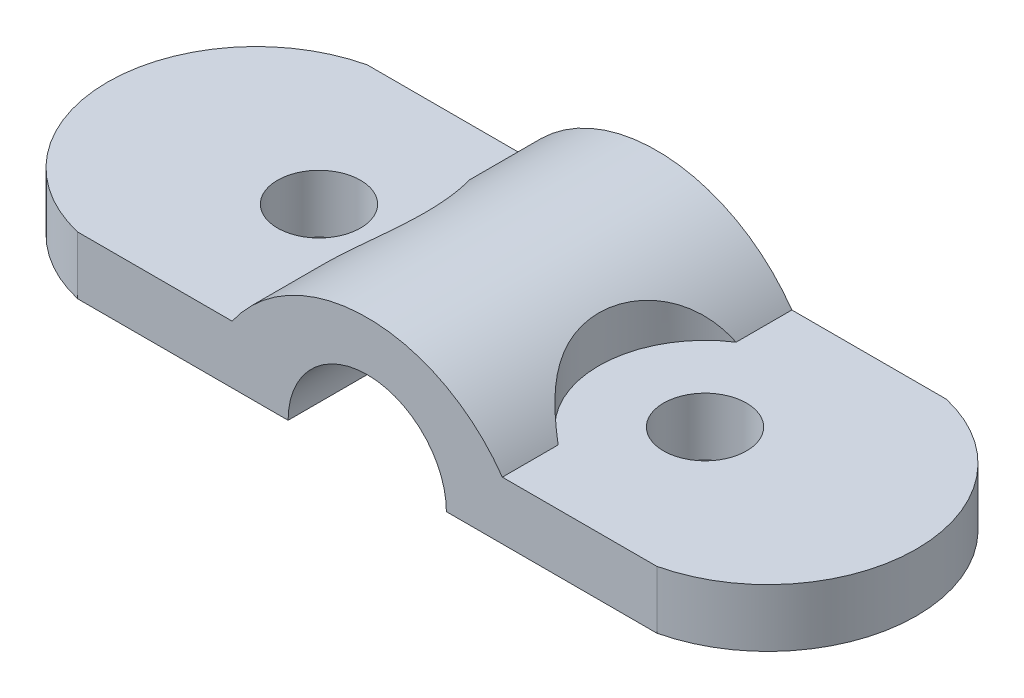
ISO-10303-21;
HEADER;
FILE_DESCRIPTION(('STEP AP214'),'2;1');
FILE_NAME('part.step','',(''),(''),'','','');
FILE_SCHEMA(('AUTOMOTIVE_DESIGN { 1 0 10303 214 1 1 1 1 }'));
ENDSEC;
DATA;
#1=APPLICATION_CONTEXT('core data for automotive mechanical design processes');
#2=APPLICATION_PROTOCOL_DEFINITION('international standard','automotive_design',2000,#1);
#3=PRODUCT_CONTEXT('',#1,'mechanical');
#4=PRODUCT('Part','Part','',(#3));
#5=PRODUCT_RELATED_PRODUCT_CATEGORY('part','',(#4));
#6=PRODUCT_DEFINITION_FORMATION('','',#4);
#7=PRODUCT_DEFINITION_CONTEXT('part definition',#1,'design');
#8=PRODUCT_DEFINITION('design','',#6,#7);
#9=PRODUCT_DEFINITION_SHAPE('','',#8);
#10=(LENGTH_UNIT() NAMED_UNIT(*) SI_UNIT(.MILLI.,.METRE.));
#11=(NAMED_UNIT(*) PLANE_ANGLE_UNIT() SI_UNIT($,.RADIAN.));
#12=(NAMED_UNIT(*) SI_UNIT($,.STERADIAN.) SOLID_ANGLE_UNIT());
#13=UNCERTAINTY_MEASURE_WITH_UNIT(LENGTH_MEASURE(1.E-05),#10,'distance_accuracy_value','');
#14=(GEOMETRIC_REPRESENTATION_CONTEXT(3) GLOBAL_UNCERTAINTY_ASSIGNED_CONTEXT((#13)) GLOBAL_UNIT_ASSIGNED_CONTEXT((#10,
#11,#12)) REPRESENTATION_CONTEXT('',''));
#15=CARTESIAN_POINT('',(0.,0.,0.));
#16=DIRECTION('',(0.,0.,1.));
#17=DIRECTION('',(1.,0.,0.));
#18=AXIS2_PLACEMENT_3D('',#15,#16,#17);
#19=CARTESIAN_POINT('',(0.,-1.87026035220902,15.));
#20=DIRECTION('',(0.,0.,-1.));
#21=DIRECTION('',(-1.,0.,0.));
#22=AXIS2_PLACEMENT_3D('',#19,#20,#21);
#23=CYLINDRICAL_SURFACE('',#22,8.52756916701935);
#24=DIRECTION('',(0.,0.,-1.));
#25=VECTOR('',#24,1.);
#26=CARTESIAN_POINT('',(-7.,3.,15.));
#27=LINE('',#26,#25);
#28=CARTESIAN_POINT('',(-7.,3.,2.89022777135356));
#29=VERTEX_POINT('',#28);
#30=CARTESIAN_POINT('',(-7.,3.,0.));
#31=VERTEX_POINT('',#30);
#32=EDGE_CURVE('E43',#29,#31,#27,.T.);
#33=ORIENTED_EDGE('',*,*,#32,.F.);
#34=CARTESIAN_POINT('',(-7.,3.,2.89022777135356));
#35=CARTESIAN_POINT('',(-6.92268728027968,3.11117549805194,2.94054057696233));
#36=CARTESIAN_POINT('',(-6.84349773405888,3.2192938672115,2.99484738439601));
#37=CARTESIAN_POINT('',(-6.6825133502771,3.42887001988714,3.11203912689447));
#38=CARTESIAN_POINT('',(-6.60071663993231,3.53032284761541,3.17493033984949));
#39=CARTESIAN_POINT('',(-6.43556714526111,3.72611279807268,3.30998560152396));
#40=CARTESIAN_POINT('',(-6.35221084105641,3.82043055104947,3.38217354866874));
#41=CARTESIAN_POINT('',(-6.18561453589318,4.00108482914601,3.53599807418573));
#42=CARTESIAN_POINT('',(-6.1023745097471,4.08742348704196,3.6176321144444));
#43=CARTESIAN_POINT('',(-5.93709189221903,4.25216312617291,3.79093157846298));
#44=CARTESIAN_POINT('',(-5.85505826438949,4.33051842990904,3.88264909680767));
#45=CARTESIAN_POINT('',(-5.69429035476473,4.4784744048078,4.07558328141524));
#46=CARTESIAN_POINT('',(-5.61555639651068,4.54807421880501,4.17680087604767));
#47=CARTESIAN_POINT('',(-5.46319541504041,4.67824748020346,4.38803550112382));
#48=CARTESIAN_POINT('',(-5.38955726232851,4.73884095330314,4.49803214741646));
#49=CARTESIAN_POINT('',(-5.2487189920238,4.85123555072687,4.72631823443613));
#50=CARTESIAN_POINT('',(-5.18151826072318,4.90303751354849,4.84460688278427));
#51=CARTESIAN_POINT('',(-5.06023394678944,4.99404783612336,5.07831401603095));
#52=CARTESIAN_POINT('',(-5.00552264368623,5.03394864687648,5.19313849966154));
#53=CARTESIAN_POINT('',(-4.90353312653237,5.10675384207423,5.42818081414692));
#54=CARTESIAN_POINT('',(-4.85625477565628,5.1396583553103,5.54839854567067));
#55=CARTESIAN_POINT('',(-4.76984144118472,5.19874189411727,5.79344340009702));
#56=CARTESIAN_POINT('',(-4.73071313424696,5.22491540962435,5.91827420431697));
#57=CARTESIAN_POINT('',(-4.66123697340056,5.27075076200323,6.17152348633035));
#58=CARTESIAN_POINT('',(-4.6308891403048,5.29041258344,6.29994197262708));
#59=CARTESIAN_POINT('',(-4.58001685543475,5.32305413194141,6.55635559098766));
#60=CARTESIAN_POINT('',(-4.55927829416608,5.33618004343954,6.68428973964994));
#61=CARTESIAN_POINT('',(-4.52685945298461,5.3565887051769,6.94180679660557));
#62=CARTESIAN_POINT('',(-4.51518227830453,5.36386945237525,7.0713902546499));
#63=CARTESIAN_POINT('',(-4.5010541627791,5.37266838631858,7.33116678665589));
#64=CARTESIAN_POINT('',(-4.49859709071402,5.37419040253249,7.46135939783829));
#65=CARTESIAN_POINT('',(-4.50292441479719,5.37150144773435,7.72159089538529));
#66=CARTESIAN_POINT('',(-4.50971301842008,5.36728786659656,7.85162968479018));
#67=CARTESIAN_POINT('',(-4.53254562297954,5.35301098622444,8.11164880275672));
#68=CARTESIAN_POINT('',(-4.54866511713952,5.34289996758092,8.24161989484403));
#69=CARTESIAN_POINT('',(-4.58999368597933,5.31667164977994,8.4994336393002));
#70=CARTESIAN_POINT('',(-4.61519862110189,5.30055708587793,8.62727723330367));
#71=CARTESIAN_POINT('',(-4.67436767121665,5.26212820321908,8.88003403499788));
#72=CARTESIAN_POINT('',(-4.70833573651212,5.23981108808239,9.00494589332383));
#73=CARTESIAN_POINT('',(-4.78452673282003,5.18876506427709,9.25082758077557));
#74=CARTESIAN_POINT('',(-4.82674646982636,5.16003863587871,9.37179891410524));
#75=CARTESIAN_POINT('',(-4.91863871445134,5.096054938595,9.60851203283065));
#76=CARTESIAN_POINT('',(-4.96828123317668,5.06082382075183,9.72427252802092));
#77=CARTESIAN_POINT('',(-5.07437317971467,4.98353254855512,9.95026155131803));
#78=CARTESIAN_POINT('',(-5.1308225675519,4.94147243430645,10.0604901119075));
#79=CARTESIAN_POINT('',(-5.24959384240145,4.85036433341084,10.2746398356368));
#80=CARTESIAN_POINT('',(-5.31191292251518,4.80131968109661,10.3785639748656));
#81=CARTESIAN_POINT('',(-5.44141785590529,4.69612096678562,10.5795488393447));
#82=CARTESIAN_POINT('',(-5.5086036280703,4.63996702326513,10.6766096789299));
#83=CARTESIAN_POINT('',(-5.6465577564401,4.52067958936611,10.8631785389924));
#84=CARTESIAN_POINT('',(-5.71731720477794,4.45756302977995,10.9527039867503));
#85=CARTESIAN_POINT('',(-5.8614034800827,4.32433499781914,11.1241635900013));
#86=CARTESIAN_POINT('',(-5.93473046119281,4.25422310500697,11.2060972886393));
#87=CARTESIAN_POINT('',(-6.08282590480577,4.10716027967403,11.362297100994));
#88=CARTESIAN_POINT('',(-6.15759530651685,4.03020476466569,11.4365580039735));
#89=CARTESIAN_POINT('',(-6.30736949015319,3.86982418328063,11.5773826299723));
#90=CARTESIAN_POINT('',(-6.38237422766719,3.78640027450677,11.6439477249687));
#91=CARTESIAN_POINT('',(-6.55007953443996,3.59198952583854,11.7851905685084));
#92=CARTESIAN_POINT('',(-6.64256106588083,3.47929409919076,11.8577932433659));
#93=CARTESIAN_POINT('',(-6.77879582132811,3.30398709899006,11.9583654847579));
#94=CARTESIAN_POINT('',(-6.82373001635837,3.24459728289984,11.9904607638796));
#95=CARTESIAN_POINT('',(-6.91263192830168,3.12379412617615,12.0520410091246));
#96=CARTESIAN_POINT('',(-6.95659981544907,3.06238114680491,12.0815264378411));
#97=CARTESIAN_POINT('',(-7.,3.,12.1097722286464));
#98=B_SPLINE_CURVE_WITH_KNOTS('',3,(#34,#35,#36,#37,#38,#39,#40,#41,#42,#43,#44,#45,#46,#47,#48,
#49,#50,#51,#52,#53,#54,#55,#56,#57,#58,#59,#60,#61,#62,#63,#64,#65,#66,#67,#68,#69,#70,#71,#72,
#73,#74,#75,#76,#77,#78,#79,#80,#81,#82,#83,#84,#85,#86,#87,#88,#89,#90,#91,#92,#93,#94,#95,#96,
#97),.UNSPECIFIED.,.F.,.F.,(4,2,2,2,2,2,2,2,2,2,2,2,2,2,2,2,2,2,2,2,2,2,2,2,2,2,2,2,2,2,2,4),
(0.,0.433346011105791,0.867010649032036,1.30181320036781,1.7364991927435,2.17354701047934,
2.61063758210038,3.0467412522891,3.48280330532549,3.88222459923133,4.28163853974723,
4.68137841124259,5.08111923025746,5.47146520580942,5.86194488942608,6.2521648642808,
6.64256247778691,7.03616371831739,7.42958585035347,7.82318564272859,8.21663338358204,
8.60853247794339,9.00042927086972,9.39213960035022,9.78384340284033,10.1746148750163,
10.565409847726,10.9564684958187,11.3474573197206,11.8353012655249,12.0785251382898,
12.321705813184),.UNSPECIFIED.);
#99=CARTESIAN_POINT('',(-7.,3.,12.1097722286464));
#100=VERTEX_POINT('',#99);
#101=EDGE_CURVE('E112',#29,#100,#98,.T.);
#102=ORIENTED_EDGE('',*,*,#101,.T.);
#103=CARTESIAN_POINT('',(-7.,3.,15.));
#104=VERTEX_POINT('',#103);
#105=EDGE_CURVE('E11',#104,#100,#27,.T.);
#106=ORIENTED_EDGE('',*,*,#105,.F.);
#107=CARTESIAN_POINT('',(0.,-1.87026035220902,15.));
#108=DIRECTION('',(0.,0.,1.));
#109=DIRECTION('',(1.,0.,0.));
#110=AXIS2_PLACEMENT_3D('',#107,#108,#109);
#111=CIRCLE('',#110,8.52756916701935);
#112=CARTESIAN_POINT('',(7.,3.,15.));
#113=VERTEX_POINT('',#112);
#114=EDGE_CURVE('E131',#104,#113,#111,.F.);
#115=ORIENTED_EDGE('',*,*,#114,.T.);
#116=DIRECTION('',(0.,0.,-1.));
#117=VECTOR('',#116,1.);
#118=CARTESIAN_POINT('',(7.,3.,15.));
#119=LINE('',#118,#117);
#120=CARTESIAN_POINT('',(7.,3.,12.1097722286464));
#121=VERTEX_POINT('',#120);
#122=EDGE_CURVE('E174',#113,#121,#119,.T.);
#123=ORIENTED_EDGE('',*,*,#122,.T.);
#124=CARTESIAN_POINT('',(7.,3.,12.1097722286464));
#125=CARTESIAN_POINT('',(6.92268728027968,3.11117549805194,12.0594594230377));
#126=CARTESIAN_POINT('',(6.84349773405888,3.2192938672115,12.005152615604));
#127=CARTESIAN_POINT('',(6.6825133502771,3.42887001988714,11.8879608731055));
#128=CARTESIAN_POINT('',(6.60071663993231,3.53032284761541,11.8250696601505));
#129=CARTESIAN_POINT('',(6.43556714526111,3.72611279807268,11.690014398476));
#130=CARTESIAN_POINT('',(6.35221084105642,3.82043055104947,11.6178264513313));
#131=CARTESIAN_POINT('',(6.18561453589318,4.00108482914601,11.4640019258143));
#132=CARTESIAN_POINT('',(6.1023745097471,4.08742348704196,11.3823678855556));
#133=CARTESIAN_POINT('',(5.93709189221903,4.2521631261729,11.209068421537));
#134=CARTESIAN_POINT('',(5.85505826438949,4.33051842990904,11.1173509031923));
#135=CARTESIAN_POINT('',(5.69429035476473,4.4784744048078,10.9244167185848));
#136=CARTESIAN_POINT('',(5.61555639651069,4.54807421880501,10.8231991239523));
#137=CARTESIAN_POINT('',(5.46319541504042,4.67824748020346,10.6119644988762));
#138=CARTESIAN_POINT('',(5.38955726232851,4.73884095330314,10.5019678525835));
#139=CARTESIAN_POINT('',(5.2487189920238,4.85123555072687,10.2736817655639));
#140=CARTESIAN_POINT('',(5.18151826072318,4.90303751354849,10.1553931172157));
#141=CARTESIAN_POINT('',(5.06023394678944,4.99404783612336,9.92168598396905));
#142=CARTESIAN_POINT('',(5.00552264368623,5.03394864687648,9.80686150033845));
#143=CARTESIAN_POINT('',(4.90353312653237,5.10675384207423,9.57181918585308));
#144=CARTESIAN_POINT('',(4.85625477565628,5.13965835531031,9.45160145432932));
#145=CARTESIAN_POINT('',(4.76984144118472,5.19874189411728,9.20655659990298));
#146=CARTESIAN_POINT('',(4.73071313424696,5.22491540962435,9.08172579568303));
#147=CARTESIAN_POINT('',(4.66123697340056,5.27075076200323,8.82847651366965));
#148=CARTESIAN_POINT('',(4.6308891403048,5.29041258344,8.70005802737292));
#149=CARTESIAN_POINT('',(4.58001685543475,5.32305413194141,8.44364440901234));
#150=CARTESIAN_POINT('',(4.55927829416608,5.33618004343953,8.31571026035007));
#151=CARTESIAN_POINT('',(4.52685945298461,5.3565887051769,8.05819320339443));
#152=CARTESIAN_POINT('',(4.51518227830453,5.36386945237525,7.92860974535011));
#153=CARTESIAN_POINT('',(4.5010541627791,5.37266838631858,7.66883321334411));
#154=CARTESIAN_POINT('',(4.49859709071402,5.37419040253249,7.53864060216171));
#155=CARTESIAN_POINT('',(4.5029244147972,5.37150144773435,7.27840910461472));
#156=CARTESIAN_POINT('',(4.50971301842008,5.36728786659656,7.14837031520982));
#157=CARTESIAN_POINT('',(4.53254562297954,5.35301098622444,6.88835119724328));
#158=CARTESIAN_POINT('',(4.54866511713952,5.34289996758092,6.75838010515597));
#159=CARTESIAN_POINT('',(4.58999368597933,5.31667164977994,6.5005663606998));
#160=CARTESIAN_POINT('',(4.61519862110189,5.30055708587793,6.37272276669634));
#161=CARTESIAN_POINT('',(4.67436767121665,5.26212820321908,6.11996596500213));
#162=CARTESIAN_POINT('',(4.70833573651212,5.23981108808239,5.99505410667617));
#163=CARTESIAN_POINT('',(4.78452673282003,5.18876506427709,5.74917241922444));
#164=CARTESIAN_POINT('',(4.82674646982635,5.16003863587871,5.62820108589477));
#165=CARTESIAN_POINT('',(4.91863871445134,5.096054938595,5.39148796716935));
#166=CARTESIAN_POINT('',(4.96828123317667,5.06082382075183,5.27572747197909));
#167=CARTESIAN_POINT('',(5.07437317971466,4.98353254855512,5.04973844868197));
#168=CARTESIAN_POINT('',(5.1308225675519,4.94147243430645,4.93950988809253));
#169=CARTESIAN_POINT('',(5.24959384240145,4.85036433341085,4.72536016436325));
#170=CARTESIAN_POINT('',(5.31191292251518,4.80131968109662,4.62143602513444));
#171=CARTESIAN_POINT('',(5.44141785590529,4.69612096678562,4.4204511606553));
#172=CARTESIAN_POINT('',(5.5086036280703,4.63996702326513,4.32339032107013));
#173=CARTESIAN_POINT('',(5.64655775644009,4.52067958936612,4.13682146100758));
#174=CARTESIAN_POINT('',(5.71731720477794,4.45756302977996,4.04729601324969));
#175=CARTESIAN_POINT('',(5.8614034800827,4.32433499781914,3.8758364099987));
#176=CARTESIAN_POINT('',(5.93473046119281,4.25422310500698,3.79390271136073));
#177=CARTESIAN_POINT('',(6.08282590480576,4.10716027967403,3.63770289900604));
#178=CARTESIAN_POINT('',(6.15759530651685,4.03020476466569,3.56344199602646));
#179=CARTESIAN_POINT('',(6.30736949015318,3.86982418328063,3.42261737002766));
#180=CARTESIAN_POINT('',(6.38237422766719,3.78640027450678,3.35605227503127));
#181=CARTESIAN_POINT('',(6.55007953443996,3.59198952583854,3.21480943149164));
#182=CARTESIAN_POINT('',(6.64256106588083,3.47929409919076,3.14220675663409));
#183=CARTESIAN_POINT('',(6.7787958213281,3.30398709899006,3.04163451524209));
#184=CARTESIAN_POINT('',(6.82373001635837,3.24459728289984,3.00953923612036));
#185=CARTESIAN_POINT('',(6.91263192830168,3.12379412617615,2.94795899087541));
#186=CARTESIAN_POINT('',(6.95659981544907,3.06238114680491,2.91847356215894));
#187=CARTESIAN_POINT('',(7.,3.,2.89022777135356));
#188=B_SPLINE_CURVE_WITH_KNOTS('',3,(#124,#125,#126,#127,#128,#129,#130,#131,#132,#133,#134,
#135,#136,#137,#138,#139,#140,#141,#142,#143,#144,#145,#146,#147,#148,#149,#150,#151,#152,#153,
#154,#155,#156,#157,#158,#159,#160,#161,#162,#163,#164,#165,#166,#167,#168,#169,#170,#171,#172,
#173,#174,#175,#176,#177,#178,#179,#180,#181,#182,#183,#184,#185,#186,#187),.UNSPECIFIED.,.F.,
.F.,(4,2,2,2,2,2,2,2,2,2,2,2,2,2,2,2,2,2,2,2,2,2,2,2,2,2,2,2,2,2,2,4),(0.,0.433346011105791,
0.867010649032035,1.30181320036781,1.7364991927435,2.17354701047934,2.61063758210038,
3.04674125228909,3.48280330532549,3.88222459923133,4.28163853974723,4.68137841124259,
5.08111923025745,5.47146520580942,5.86194488942607,6.25216486428079,6.6425624777869,
7.03616371831739,7.42958585035346,7.82318564272858,8.21663338358203,8.60853247794338,
9.00042927086971,9.39213960035021,9.78384340284033,10.1746148750163,10.565409847726,
10.9564684958186,11.3474573197206,11.8353012655249,12.0785251382898,12.321705813184),.UNSPECIFIED.);
#189=CARTESIAN_POINT('',(7.,3.,2.89022777135356));
#190=VERTEX_POINT('',#189);
#191=EDGE_CURVE('E189',#121,#190,#188,.T.);
#192=ORIENTED_EDGE('',*,*,#191,.T.);
#193=CARTESIAN_POINT('',(7.,3.,0.));
#194=VERTEX_POINT('',#193);
#195=EDGE_CURVE('E150',#190,#194,#119,.T.);
#196=ORIENTED_EDGE('',*,*,#195,.T.);
#197=CARTESIAN_POINT('',(0.,-1.87026035220902,0.));
#198=DIRECTION('',(0.,0.,1.));
#199=DIRECTION('',(1.,0.,0.));
#200=AXIS2_PLACEMENT_3D('',#197,#198,#199);
#201=CIRCLE('',#200,8.52756916701935);
#202=EDGE_CURVE('E151',#31,#194,#201,.F.);
#203=ORIENTED_EDGE('',*,*,#202,.F.);
#204=EDGE_LOOP('',(#33,#102,#106,#115,#123,#192,#196,#203));
#205=FACE_BOUND('',#204,.T.);
#206=ADVANCED_FACE('F35',(#205),#23,.T.);
#207=CARTESIAN_POINT('',(0.,3.,15.));
#208=DIRECTION('',(0.,1.,0.));
#209=DIRECTION('',(0.,0.,1.));
#210=AXIS2_PLACEMENT_3D('',#207,#208,#209);
#211=PLANE('',#210);
#212=CARTESIAN_POINT('',(-10.,3.,7.5));
#213=DIRECTION('',(0.,1.,0.));
#214=DIRECTION('',(-1.,0.,0.));
#215=AXIS2_PLACEMENT_3D('',#212,#213,#214);
#216=CIRCLE('',#215,2.15);
#217=CARTESIAN_POINT('',(-12.15,3.,7.5));
#218=VERTEX_POINT('',#217);
#219=EDGE_CURVE('E310',#218,#218,#216,.T.);
#220=ORIENTED_EDGE('',*,*,#219,.F.);
#221=EDGE_LOOP('',(#220));
#222=FACE_BOUND('',#221,.T.);
#223=ORIENTED_EDGE('',*,*,#105,.T.);
#224=CARTESIAN_POINT('',(-10.,3.,7.5));
#225=DIRECTION('',(0.,1.,0.));
#226=DIRECTION('',(-1.,0.,0.));
#227=AXIS2_PLACEMENT_3D('',#224,#225,#226);
#228=CIRCLE('',#227,5.5);
#229=EDGE_CURVE('E49',#100,#29,#228,.T.);
#230=ORIENTED_EDGE('',*,*,#229,.T.);
#231=ORIENTED_EDGE('',*,*,#32,.T.);
#232=DIRECTION('',(1.,0.,0.));
#233=VECTOR('',#232,1.);
#234=CARTESIAN_POINT('',(0.,3.,0.));
#235=LINE('',#234,#233);
#236=CARTESIAN_POINT('',(-15.,3.,0.));
#237=VERTEX_POINT('',#236);
#238=EDGE_CURVE('E154',#237,#31,#235,.T.);
#239=ORIENTED_EDGE('',*,*,#238,.F.);
#240=CARTESIAN_POINT('',(-13.2564404225837,3.,7.5));
#241=DIRECTION('',(0.,1.,0.));
#242=DIRECTION('',(-1.,0.,0.));
#243=AXIS2_PLACEMENT_3D('',#240,#241,#242);
#244=CIRCLE('',#243,7.7);
#245=CARTESIAN_POINT('',(-15.,3.,15.));
#246=VERTEX_POINT('',#245);
#247=EDGE_CURVE('E127',#246,#237,#244,.F.);
#248=ORIENTED_EDGE('',*,*,#247,.F.);
#249=DIRECTION('',(1.,0.,0.));
#250=VECTOR('',#249,1.);
#251=CARTESIAN_POINT('',(0.,3.,15.));
#252=LINE('',#251,#250);
#253=EDGE_CURVE('E125',#246,#104,#252,.T.);
#254=ORIENTED_EDGE('',*,*,#253,.T.);
#255=EDGE_LOOP('',(#223,#230,#231,#239,#248,#254));
#256=FACE_BOUND('',#255,.T.);
#257=ADVANCED_FACE('F122',(#222,#256),#211,.T.);
#258=CARTESIAN_POINT('',(0.,0.,15.));
#259=DIRECTION('',(0.,-1.,0.));
#260=DIRECTION('',(0.,0.,-1.));
#261=AXIS2_PLACEMENT_3D('',#258,#259,#260);
#262=PLANE('',#261);
#263=CARTESIAN_POINT('',(-10.,0.,7.5));
#264=DIRECTION('',(0.,1.,0.));
#265=DIRECTION('',(-1.,0.,0.));
#266=AXIS2_PLACEMENT_3D('',#263,#264,#265);
#267=CIRCLE('',#266,2.15);
#268=CARTESIAN_POINT('',(-12.15,0.,7.5));
#269=VERTEX_POINT('',#268);
#270=EDGE_CURVE('E313',#269,#269,#267,.T.);
#271=ORIENTED_EDGE('',*,*,#270,.T.);
#272=EDGE_LOOP('',(#271));
#273=FACE_BOUND('',#272,.T.);
#274=DIRECTION('',(-1.,0.,0.));
#275=VECTOR('',#274,1.);
#276=CARTESIAN_POINT('',(0.,0.,0.));
#277=LINE('',#276,#275);
#278=CARTESIAN_POINT('',(-4.1,0.,0.));
#279=VERTEX_POINT('',#278);
#280=CARTESIAN_POINT('',(-15.,0.,0.));
#281=VERTEX_POINT('',#280);
#282=EDGE_CURVE('E161',#279,#281,#277,.T.);
#283=ORIENTED_EDGE('',*,*,#282,.F.);
#284=DIRECTION('',(0.,0.,-1.));
#285=VECTOR('',#284,1.);
#286=CARTESIAN_POINT('',(-4.1,0.,15.));
#287=LINE('',#286,#285);
#288=CARTESIAN_POINT('',(-4.1,0.,15.));
#289=VERTEX_POINT('',#288);
#290=EDGE_CURVE('E178',#289,#279,#287,.T.);
#291=ORIENTED_EDGE('',*,*,#290,.F.);
#292=DIRECTION('',(-1.,0.,0.));
#293=VECTOR('',#292,1.);
#294=CARTESIAN_POINT('',(0.,0.,15.));
#295=LINE('',#294,#293);
#296=CARTESIAN_POINT('',(-15.,0.,15.));
#297=VERTEX_POINT('',#296);
#298=EDGE_CURVE('E133',#289,#297,#295,.T.);
#299=ORIENTED_EDGE('',*,*,#298,.T.);
#300=CARTESIAN_POINT('',(-13.2564404225837,0.,7.5));
#301=DIRECTION('',(0.,1.,0.));
#302=DIRECTION('',(-1.,0.,0.));
#303=AXIS2_PLACEMENT_3D('',#300,#301,#302);
#304=CIRCLE('',#303,7.7);
#305=EDGE_CURVE('E188',#297,#281,#304,.F.);
#306=ORIENTED_EDGE('',*,*,#305,.T.);
#307=EDGE_LOOP('',(#283,#291,#299,#306));
#308=FACE_BOUND('',#307,.T.);
#309=ADVANCED_FACE('F214',(#273,#308),#262,.T.);
#310=CARTESIAN_POINT('',(0.,0.,15.));
#311=DIRECTION('',(0.,0.,-1.));
#312=DIRECTION('',(-1.,0.,0.));
#313=AXIS2_PLACEMENT_3D('',#310,#311,#312);
#314=CYLINDRICAL_SURFACE('',#313,4.1);
#315=CARTESIAN_POINT('',(0.,0.,0.));
#316=DIRECTION('',(0.,0.,1.));
#317=DIRECTION('',(1.,0.,0.));
#318=AXIS2_PLACEMENT_3D('',#315,#316,#317);
#319=CIRCLE('',#318,4.1);
#320=CARTESIAN_POINT('',(4.1,0.,0.));
#321=VERTEX_POINT('',#320);
#322=EDGE_CURVE('E164',#321,#279,#319,.T.);
#323=ORIENTED_EDGE('',*,*,#322,.F.);
#324=DIRECTION('',(0.,0.,-1.));
#325=VECTOR('',#324,1.);
#326=CARTESIAN_POINT('',(4.1,0.,15.));
#327=LINE('',#326,#325);
#328=CARTESIAN_POINT('',(4.1,0.,15.));
#329=VERTEX_POINT('',#328);
#330=EDGE_CURVE('E177',#329,#321,#327,.T.);
#331=ORIENTED_EDGE('',*,*,#330,.F.);
#332=CARTESIAN_POINT('',(0.,0.,15.));
#333=DIRECTION('',(0.,0.,1.));
#334=DIRECTION('',(1.,0.,0.));
#335=AXIS2_PLACEMENT_3D('',#332,#333,#334);
#336=CIRCLE('',#335,4.1);
#337=EDGE_CURVE('E141',#329,#289,#336,.T.);
#338=ORIENTED_EDGE('',*,*,#337,.T.);
#339=ORIENTED_EDGE('',*,*,#290,.T.);
#340=EDGE_LOOP('',(#323,#331,#338,#339));
#341=FACE_BOUND('',#340,.T.);
#342=ADVANCED_FACE('F207',(#341),#314,.F.);
#343=CARTESIAN_POINT('',(0.,0.,15.));
#344=DIRECTION('',(0.,1.,0.));
#345=DIRECTION('',(0.,0.,1.));
#346=AXIS2_PLACEMENT_3D('',#343,#344,#345);
#347=PLANE('',#346);
#348=CARTESIAN_POINT('',(10.,0.,7.5));
#349=DIRECTION('',(0.,1.,0.));
#350=DIRECTION('',(-1.,0.,0.));
#351=AXIS2_PLACEMENT_3D('',#348,#349,#350);
#352=CIRCLE('',#351,2.15);
#353=CARTESIAN_POINT('',(7.85,0.,7.5));
#354=VERTEX_POINT('',#353);
#355=EDGE_CURVE('E114',#354,#354,#352,.T.);
#356=ORIENTED_EDGE('',*,*,#355,.T.);
#357=EDGE_LOOP('',(#356));
#358=FACE_BOUND('',#357,.T.);
#359=DIRECTION('',(1.,0.,0.));
#360=VECTOR('',#359,1.);
#361=CARTESIAN_POINT('',(0.,0.,0.));
#362=LINE('',#361,#360);
#363=CARTESIAN_POINT('',(15.,0.,0.));
#364=VERTEX_POINT('',#363);
#365=EDGE_CURVE('E167',#321,#364,#362,.T.);
#366=ORIENTED_EDGE('',*,*,#365,.T.);
#367=CARTESIAN_POINT('',(13.2564404225837,0.,7.5));
#368=DIRECTION('',(0.,1.,0.));
#369=DIRECTION('',(-1.,0.,0.));
#370=AXIS2_PLACEMENT_3D('',#367,#368,#369);
#371=CIRCLE('',#370,7.7);
#372=CARTESIAN_POINT('',(15.,0.,15.));
#373=VERTEX_POINT('',#372);
#374=EDGE_CURVE('E155',#373,#364,#371,.T.);
#375=ORIENTED_EDGE('',*,*,#374,.F.);
#376=DIRECTION('',(1.,0.,0.));
#377=VECTOR('',#376,1.);
#378=CARTESIAN_POINT('',(0.,0.,15.));
#379=LINE('',#378,#377);
#380=EDGE_CURVE('E144',#329,#373,#379,.T.);
#381=ORIENTED_EDGE('',*,*,#380,.F.);
#382=ORIENTED_EDGE('',*,*,#330,.T.);
#383=EDGE_LOOP('',(#366,#375,#381,#382));
#384=FACE_BOUND('',#383,.T.);
#385=ADVANCED_FACE('F210',(#358,#384),#347,.F.);
#386=CARTESIAN_POINT('',(0.,3.,15.));
#387=DIRECTION('',(0.,-1.,0.));
#388=DIRECTION('',(1.,0.,0.));
#389=AXIS2_PLACEMENT_3D('',#386,#387,#388);
#390=PLANE('',#389);
#391=CARTESIAN_POINT('',(10.,3.,7.5));
#392=DIRECTION('',(0.,1.,0.));
#393=DIRECTION('',(-1.,0.,0.));
#394=AXIS2_PLACEMENT_3D('',#391,#392,#393);
#395=CIRCLE('',#394,2.15);
#396=CARTESIAN_POINT('',(7.85,3.,7.5));
#397=VERTEX_POINT('',#396);
#398=EDGE_CURVE('E307',#397,#397,#395,.T.);
#399=ORIENTED_EDGE('',*,*,#398,.F.);
#400=EDGE_LOOP('',(#399));
#401=FACE_BOUND('',#400,.T.);
#402=ORIENTED_EDGE('',*,*,#195,.F.);
#403=CARTESIAN_POINT('',(10.,3.,7.5));
#404=DIRECTION('',(0.,1.,0.));
#405=DIRECTION('',(-1.,0.,0.));
#406=AXIS2_PLACEMENT_3D('',#403,#404,#405);
#407=CIRCLE('',#406,5.5);
#408=EDGE_CURVE('E57',#190,#121,#407,.T.);
#409=ORIENTED_EDGE('',*,*,#408,.T.);
#410=ORIENTED_EDGE('',*,*,#122,.F.);
#411=DIRECTION('',(-1.,0.,0.));
#412=VECTOR('',#411,1.);
#413=CARTESIAN_POINT('',(0.,3.,15.));
#414=LINE('',#413,#412);
#415=CARTESIAN_POINT('',(15.,3.,15.));
#416=VERTEX_POINT('',#415);
#417=EDGE_CURVE('E148',#416,#113,#414,.T.);
#418=ORIENTED_EDGE('',*,*,#417,.F.);
#419=CARTESIAN_POINT('',(13.2564404225837,3.,7.5));
#420=DIRECTION('',(0.,1.,0.));
#421=DIRECTION('',(-1.,0.,0.));
#422=AXIS2_PLACEMENT_3D('',#419,#420,#421);
#423=CIRCLE('',#422,7.7);
#424=CARTESIAN_POINT('',(15.,3.,0.));
#425=VERTEX_POINT('',#424);
#426=EDGE_CURVE('E191',#416,#425,#423,.T.);
#427=ORIENTED_EDGE('',*,*,#426,.T.);
#428=DIRECTION('',(-1.,0.,0.));
#429=VECTOR('',#428,1.);
#430=CARTESIAN_POINT('',(0.,3.,0.));
#431=LINE('',#430,#429);
#432=EDGE_CURVE('E135',#425,#194,#431,.T.);
#433=ORIENTED_EDGE('',*,*,#432,.T.);
#434=EDGE_LOOP('',(#402,#409,#410,#418,#427,#433));
#435=FACE_BOUND('',#434,.T.);
#436=ADVANCED_FACE('F199',(#401,#435),#390,.F.);
#437=CARTESIAN_POINT('',(0.,0.,15.));
#438=DIRECTION('',(0.,0.,1.));
#439=DIRECTION('',(1.,0.,0.));
#440=AXIS2_PLACEMENT_3D('',#437,#438,#439);
#441=PLANE('',#440);
#442=ORIENTED_EDGE('',*,*,#114,.F.);
#443=ORIENTED_EDGE('',*,*,#253,.F.);
#444=DIRECTION('',(0.,1.,0.));
#445=VECTOR('',#444,1.);
#446=CARTESIAN_POINT('',(-15.,0.,15.));
#447=LINE('',#446,#445);
#448=EDGE_CURVE('E130',#297,#246,#447,.T.);
#449=ORIENTED_EDGE('',*,*,#448,.F.);
#450=ORIENTED_EDGE('',*,*,#298,.F.);
#451=ORIENTED_EDGE('',*,*,#337,.F.);
#452=ORIENTED_EDGE('',*,*,#380,.T.);
#453=DIRECTION('',(0.,1.,0.));
#454=VECTOR('',#453,1.);
#455=CARTESIAN_POINT('',(15.,0.,15.));
#456=LINE('',#455,#454);
#457=EDGE_CURVE('E146',#373,#416,#456,.T.);
#458=ORIENTED_EDGE('',*,*,#457,.T.);
#459=ORIENTED_EDGE('',*,*,#417,.T.);
#460=EDGE_LOOP('',(#442,#443,#449,#450,#451,#452,#458,#459));
#461=FACE_BOUND('',#460,.T.);
#462=ADVANCED_FACE('F212',(#461),#441,.T.);
#463=CARTESIAN_POINT('',(0.,0.,0.));
#464=DIRECTION('',(0.,0.,1.));
#465=DIRECTION('',(1.,0.,0.));
#466=AXIS2_PLACEMENT_3D('',#463,#464,#465);
#467=PLANE('',#466);
#468=ORIENTED_EDGE('',*,*,#202,.T.);
#469=ORIENTED_EDGE('',*,*,#432,.F.);
#470=DIRECTION('',(0.,1.,0.));
#471=VECTOR('',#470,1.);
#472=CARTESIAN_POINT('',(15.,0.,0.));
#473=LINE('',#472,#471);
#474=EDGE_CURVE('E169',#364,#425,#473,.T.);
#475=ORIENTED_EDGE('',*,*,#474,.F.);
#476=ORIENTED_EDGE('',*,*,#365,.F.);
#477=ORIENTED_EDGE('',*,*,#322,.T.);
#478=ORIENTED_EDGE('',*,*,#282,.T.);
#479=DIRECTION('',(0.,1.,0.));
#480=VECTOR('',#479,1.);
#481=CARTESIAN_POINT('',(-15.,0.,0.));
#482=LINE('',#481,#480);
#483=EDGE_CURVE('E158',#281,#237,#482,.T.);
#484=ORIENTED_EDGE('',*,*,#483,.T.);
#485=ORIENTED_EDGE('',*,*,#238,.T.);
#486=EDGE_LOOP('',(#468,#469,#475,#476,#477,#478,#484,#485));
#487=FACE_BOUND('',#486,.T.);
#488=ADVANCED_FACE('F184',(#487),#467,.F.);
#489=CARTESIAN_POINT('',(13.2564404225837,0.,7.5));
#490=DIRECTION('',(0.,1.,0.));
#491=DIRECTION('',(-1.,0.,0.));
#492=AXIS2_PLACEMENT_3D('',#489,#490,#491);
#493=CYLINDRICAL_SURFACE('',#492,7.7);
#494=ORIENTED_EDGE('',*,*,#426,.F.);
#495=ORIENTED_EDGE('',*,*,#457,.F.);
#496=ORIENTED_EDGE('',*,*,#374,.T.);
#497=ORIENTED_EDGE('',*,*,#474,.T.);
#498=EDGE_LOOP('',(#494,#495,#496,#497));
#499=FACE_BOUND('',#498,.T.);
#500=ADVANCED_FACE('F202',(#499),#493,.T.);
#501=CARTESIAN_POINT('',(-13.2564404225837,0.,7.5));
#502=DIRECTION('',(0.,1.,0.));
#503=DIRECTION('',(-1.,0.,0.));
#504=AXIS2_PLACEMENT_3D('',#501,#502,#503);
#505=CYLINDRICAL_SURFACE('',#504,7.7);
#506=ORIENTED_EDGE('',*,*,#247,.T.);
#507=ORIENTED_EDGE('',*,*,#483,.F.);
#508=ORIENTED_EDGE('',*,*,#305,.F.);
#509=ORIENTED_EDGE('',*,*,#448,.T.);
#510=EDGE_LOOP('',(#506,#507,#508,#509));
#511=FACE_BOUND('',#510,.T.);
#512=ADVANCED_FACE('F187',(#511),#505,.T.);
#513=CARTESIAN_POINT('',(10.,6.,7.5));
#514=DIRECTION('',(0.,-1.,0.));
#515=DIRECTION('',(1.,0.,0.));
#516=AXIS2_PLACEMENT_3D('',#513,#514,#515);
#517=CYLINDRICAL_SURFACE('',#516,5.5);
#518=ORIENTED_EDGE('',*,*,#408,.F.);
#519=ORIENTED_EDGE('',*,*,#191,.F.);
#520=EDGE_LOOP('',(#518,#519));
#521=FACE_BOUND('',#520,.T.);
#522=ADVANCED_FACE('F296',(#521),#517,.F.);
#523=CARTESIAN_POINT('',(-10.,6.,7.5));
#524=DIRECTION('',(0.,-1.,0.));
#525=DIRECTION('',(1.,0.,0.));
#526=AXIS2_PLACEMENT_3D('',#523,#524,#525);
#527=CYLINDRICAL_SURFACE('',#526,5.5);
#528=ORIENTED_EDGE('',*,*,#229,.F.);
#529=ORIENTED_EDGE('',*,*,#101,.F.);
#530=EDGE_LOOP('',(#528,#529));
#531=FACE_BOUND('',#530,.T.);
#532=ADVANCED_FACE('F111',(#531),#527,.F.);
#533=CARTESIAN_POINT('',(10.,0.,7.5));
#534=DIRECTION('',(0.,1.,0.));
#535=DIRECTION('',(-1.,0.,0.));
#536=AXIS2_PLACEMENT_3D('',#533,#534,#535);
#537=CYLINDRICAL_SURFACE('',#536,2.15);
#538=ORIENTED_EDGE('',*,*,#355,.F.);
#539=EDGE_LOOP('',(#538));
#540=FACE_BOUND('',#539,.T.);
#541=ORIENTED_EDGE('',*,*,#398,.T.);
#542=EDGE_LOOP('',(#541));
#543=FACE_BOUND('',#542,.T.);
#544=ADVANCED_FACE('F272',(#540,#543),#537,.F.);
#545=CARTESIAN_POINT('',(-10.,0.,7.5));
#546=DIRECTION('',(0.,1.,0.));
#547=DIRECTION('',(-1.,0.,0.));
#548=AXIS2_PLACEMENT_3D('',#545,#546,#547);
#549=CYLINDRICAL_SURFACE('',#548,2.15);
#550=ORIENTED_EDGE('',*,*,#270,.F.);
#551=EDGE_LOOP('',(#550));
#552=FACE_BOUND('',#551,.T.);
#553=ORIENTED_EDGE('',*,*,#219,.T.);
#554=EDGE_LOOP('',(#553));
#555=FACE_BOUND('',#554,.T.);
#556=ADVANCED_FACE('F277',(#552,#555),#549,.F.);
#557=CLOSED_SHELL('',(#206,#257,#309,#342,#385,#436,#462,#488,#500,#512,#522,#532,#544,#556));
#558=MANIFOLD_SOLID_BREP('B2',#557);
#559=ADVANCED_BREP_SHAPE_REPRESENTATION('',(#18,#558),#14);
#560=SHAPE_DEFINITION_REPRESENTATION(#9,#559);
ENDSEC;
END-ISO-10303-21;
